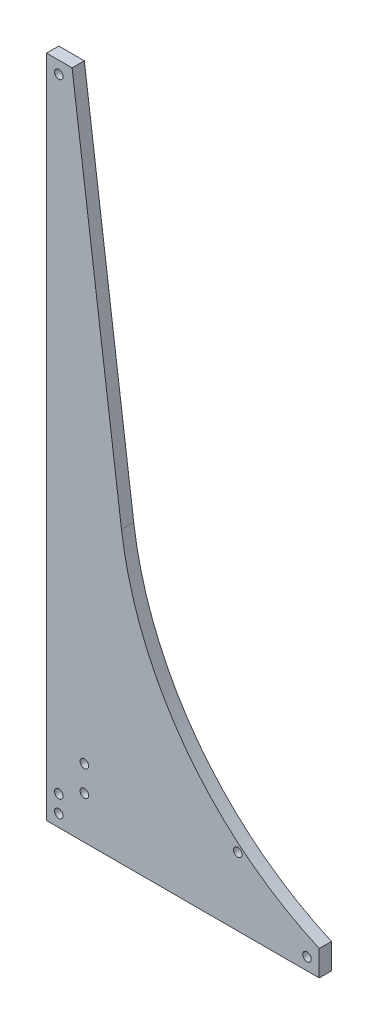
ISO-10303-21;
HEADER;
FILE_DESCRIPTION(('STEP AP214'),'2;1');
FILE_NAME('part.step','',(''),(''),'','','');
FILE_SCHEMA(('AUTOMOTIVE_DESIGN { 1 0 10303 214 1 1 1 1 }'));
ENDSEC;
DATA;
#1=APPLICATION_CONTEXT('core data for automotive mechanical design processes');
#2=APPLICATION_PROTOCOL_DEFINITION('international standard','automotive_design',2000,#1);
#3=PRODUCT_CONTEXT('',#1,'mechanical');
#4=PRODUCT('Part','Part','',(#3));
#5=PRODUCT_RELATED_PRODUCT_CATEGORY('part','',(#4));
#6=PRODUCT_DEFINITION_FORMATION('','',#4);
#7=PRODUCT_DEFINITION_CONTEXT('part definition',#1,'design');
#8=PRODUCT_DEFINITION('design','',#6,#7);
#9=PRODUCT_DEFINITION_SHAPE('','',#8);
#10=(LENGTH_UNIT() NAMED_UNIT(*) SI_UNIT(.MILLI.,.METRE.));
#11=(NAMED_UNIT(*) PLANE_ANGLE_UNIT() SI_UNIT($,.RADIAN.));
#12=(NAMED_UNIT(*) SI_UNIT($,.STERADIAN.) SOLID_ANGLE_UNIT());
#13=UNCERTAINTY_MEASURE_WITH_UNIT(LENGTH_MEASURE(1.E-05),#10,'distance_accuracy_value','');
#14=(GEOMETRIC_REPRESENTATION_CONTEXT(3) GLOBAL_UNCERTAINTY_ASSIGNED_CONTEXT((#13)) GLOBAL_UNIT_ASSIGNED_CONTEXT((#10,
#11,#12)) REPRESENTATION_CONTEXT('',''));
#15=CARTESIAN_POINT('',(0.,0.,0.));
#16=DIRECTION('',(0.,0.,1.));
#17=DIRECTION('',(1.,0.,0.));
#18=AXIS2_PLACEMENT_3D('',#15,#16,#17);
#19=CARTESIAN_POINT('',(609.538956344785,497.34603180991,18.25625));
#20=DIRECTION('',(0.,0.,1.));
#21=DIRECTION('',(1.,0.,0.));
#22=AXIS2_PLACEMENT_3D('',#19,#20,#21);
#23=PLANE('',#22);
#24=CARTESIAN_POINT('',(18.25625,43.65625,18.25625));
#25=DIRECTION('',(0.,0.,1.));
#26=DIRECTION('',(1.,0.,0.));
#27=AXIS2_PLACEMENT_3D('',#24,#25,#26);
#28=CIRCLE('',#27,6.35);
#29=CARTESIAN_POINT('',(24.60625,43.65625,18.25625));
#30=VERTEX_POINT('',#29);
#31=EDGE_CURVE('E224',#30,#30,#28,.T.);
#32=ORIENTED_EDGE('',*,*,#31,.F.);
#33=EDGE_LOOP('',(#32));
#34=FACE_BOUND('',#33,.T.);
#35=CARTESIAN_POINT('',(56.35625,101.6,18.25625));
#36=DIRECTION('',(0.,0.,1.));
#37=DIRECTION('',(1.,0.,0.));
#38=AXIS2_PLACEMENT_3D('',#35,#36,#37);
#39=CIRCLE('',#38,6.35);
#40=CARTESIAN_POINT('',(62.70625,101.6,18.25625));
#41=VERTEX_POINT('',#40);
#42=EDGE_CURVE('E240',#41,#41,#39,.T.);
#43=ORIENTED_EDGE('',*,*,#42,.F.);
#44=EDGE_LOOP('',(#43));
#45=FACE_BOUND('',#44,.T.);
#46=CARTESIAN_POINT('',(388.14375,18.25625,18.25625));
#47=DIRECTION('',(0.,0.,1.));
#48=DIRECTION('',(1.,0.,0.));
#49=AXIS2_PLACEMENT_3D('',#46,#47,#48);
#50=CIRCLE('',#49,6.34999999999994);
#51=CARTESIAN_POINT('',(394.49375,18.25625,18.25625));
#52=VERTEX_POINT('',#51);
#53=EDGE_CURVE('E256',#52,#52,#50,.T.);
#54=ORIENTED_EDGE('',*,*,#53,.F.);
#55=EDGE_LOOP('',(#54));
#56=FACE_BOUND('',#55,.T.);
#57=DIRECTION('',(0.,-1.,0.));
#58=VECTOR('',#57,1.);
#59=CARTESIAN_POINT('',(0.,0.,18.25625));
#60=LINE('',#59,#58);
#61=CARTESIAN_POINT('',(0.,990.6,18.25625));
#62=VERTEX_POINT('',#61);
#63=CARTESIAN_POINT('',(0.,0.,18.25625));
#64=VERTEX_POINT('',#63);
#65=EDGE_CURVE('E146',#62,#64,#60,.T.);
#66=ORIENTED_EDGE('',*,*,#65,.T.);
#67=DIRECTION('',(1.,0.,0.));
#68=VECTOR('',#67,1.);
#69=CARTESIAN_POINT('',(0.,0.,18.25625));
#70=LINE('',#69,#68);
#71=CARTESIAN_POINT('',(406.4,0.,18.25625));
#72=VERTEX_POINT('',#71);
#73=EDGE_CURVE('E94',#64,#72,#70,.T.);
#74=ORIENTED_EDGE('',*,*,#73,.T.);
#75=DIRECTION('',(0.,1.,0.));
#76=VECTOR('',#75,1.);
#77=CARTESIAN_POINT('',(406.4,38.1,18.25625));
#78=LINE('',#77,#76);
#79=CARTESIAN_POINT('',(406.4,38.1,18.25625));
#80=VERTEX_POINT('',#79);
#81=EDGE_CURVE('E107',#72,#80,#78,.T.);
#82=ORIENTED_EDGE('',*,*,#81,.T.);
#83=CARTESIAN_POINT('',(609.538956344785,497.34603180991,18.25625));
#84=DIRECTION('',(0.,0.,-1.));
#85=DIRECTION('',(1.,0.,0.));
#86=AXIS2_PLACEMENT_3D('',#83,#84,#85);
#87=CIRCLE('',#86,502.167654591569);
#88=CARTESIAN_POINT('',(111.667415651835,431.8,18.25625));
#89=VERTEX_POINT('',#88);
#90=EDGE_CURVE('E101',#80,#89,#87,.T.);
#91=ORIENTED_EDGE('',*,*,#90,.T.);
#92=DIRECTION('',(-0.130526192220048,0.991444861373811,0.));
#93=VECTOR('',#92,1.);
#94=CARTESIAN_POINT('',(38.1,990.6,18.25625));
#95=LINE('',#94,#93);
#96=CARTESIAN_POINT('',(38.1,990.6,18.25625));
#97=VERTEX_POINT('',#96);
#98=EDGE_CURVE('E105',#89,#97,#95,.T.);
#99=ORIENTED_EDGE('',*,*,#98,.T.);
#100=DIRECTION('',(-1.,0.,0.));
#101=VECTOR('',#100,1.);
#102=CARTESIAN_POINT('',(0.,990.6,18.25625));
#103=LINE('',#102,#101);
#104=EDGE_CURVE('E57',#97,#62,#103,.T.);
#105=ORIENTED_EDGE('',*,*,#104,.T.);
#106=EDGE_LOOP('',(#66,#74,#82,#91,#99,#105));
#107=FACE_BOUND('',#106,.T.);
#108=CARTESIAN_POINT('',(18.25625,18.25625,18.25625));
#109=DIRECTION('',(0.,0.,1.));
#110=DIRECTION('',(1.,0.,0.));
#111=AXIS2_PLACEMENT_3D('',#108,#109,#110);
#112=CIRCLE('',#111,6.35);
#113=CARTESIAN_POINT('',(24.60625,18.25625,18.25625));
#114=VERTEX_POINT('',#113);
#115=EDGE_CURVE('E134',#114,#114,#112,.T.);
#116=ORIENTED_EDGE('',*,*,#115,.F.);
#117=EDGE_LOOP('',(#116));
#118=FACE_BOUND('',#117,.T.);
#119=CARTESIAN_POINT('',(18.25625,972.34375,18.25625));
#120=DIRECTION('',(0.,0.,1.));
#121=DIRECTION('',(1.,0.,0.));
#122=AXIS2_PLACEMENT_3D('',#119,#120,#121);
#123=CIRCLE('',#122,6.35);
#124=CARTESIAN_POINT('',(24.60625,972.34375,18.25625));
#125=VERTEX_POINT('',#124);
#126=EDGE_CURVE('E248',#125,#125,#123,.T.);
#127=ORIENTED_EDGE('',*,*,#126,.F.);
#128=EDGE_LOOP('',(#127));
#129=FACE_BOUND('',#128,.T.);
#130=CARTESIAN_POINT('',(284.95625,101.6,18.25625));
#131=DIRECTION('',(0.,0.,1.));
#132=DIRECTION('',(1.,0.,0.));
#133=AXIS2_PLACEMENT_3D('',#130,#131,#132);
#134=CIRCLE('',#133,6.35);
#135=CARTESIAN_POINT('',(291.30625,101.6,18.25625));
#136=VERTEX_POINT('',#135);
#137=EDGE_CURVE('E232',#136,#136,#134,.T.);
#138=ORIENTED_EDGE('',*,*,#137,.F.);
#139=EDGE_LOOP('',(#138));
#140=FACE_BOUND('',#139,.T.);
#141=CARTESIAN_POINT('',(56.35625,63.5,18.25625));
#142=DIRECTION('',(0.,0.,1.));
#143=DIRECTION('',(1.,0.,0.));
#144=AXIS2_PLACEMENT_3D('',#141,#142,#143);
#145=CIRCLE('',#144,6.35);
#146=CARTESIAN_POINT('',(62.70625,63.5,18.25625));
#147=VERTEX_POINT('',#146);
#148=EDGE_CURVE('E213',#147,#147,#145,.T.);
#149=ORIENTED_EDGE('',*,*,#148,.F.);
#150=EDGE_LOOP('',(#149));
#151=FACE_BOUND('',#150,.T.);
#152=ADVANCED_FACE('F39',(#34,#45,#56,#107,#118,#129,#140,#151),#23,.T.);
#153=CARTESIAN_POINT('',(609.538956344785,497.34603180991,0.));
#154=DIRECTION('',(0.,0.,1.));
#155=DIRECTION('',(1.,0.,0.));
#156=AXIS2_PLACEMENT_3D('',#153,#154,#155);
#157=PLANE('',#156);
#158=DIRECTION('',(0.,-1.,0.));
#159=VECTOR('',#158,1.);
#160=CARTESIAN_POINT('',(0.,0.,0.));
#161=LINE('',#160,#159);
#162=CARTESIAN_POINT('',(0.,990.6,0.));
#163=VERTEX_POINT('',#162);
#164=CARTESIAN_POINT('',(0.,0.,0.));
#165=VERTEX_POINT('',#164);
#166=EDGE_CURVE('E129',#163,#165,#161,.T.);
#167=ORIENTED_EDGE('',*,*,#166,.F.);
#168=DIRECTION('',(-1.,0.,0.));
#169=VECTOR('',#168,1.);
#170=CARTESIAN_POINT('',(0.,990.6,0.));
#171=LINE('',#170,#169);
#172=CARTESIAN_POINT('',(38.1,990.6,0.));
#173=VERTEX_POINT('',#172);
#174=EDGE_CURVE('E86',#173,#163,#171,.T.);
#175=ORIENTED_EDGE('',*,*,#174,.F.);
#176=DIRECTION('',(-0.130526192220048,0.991444861373811,0.));
#177=VECTOR('',#176,1.);
#178=CARTESIAN_POINT('',(38.1,990.6,0.));
#179=LINE('',#178,#177);
#180=CARTESIAN_POINT('',(111.667415651835,431.8,0.));
#181=VERTEX_POINT('',#180);
#182=EDGE_CURVE('E80',#181,#173,#179,.T.);
#183=ORIENTED_EDGE('',*,*,#182,.F.);
#184=CARTESIAN_POINT('',(609.538956344785,497.34603180991,0.));
#185=DIRECTION('',(0.,0.,-1.));
#186=DIRECTION('',(1.,0.,0.));
#187=AXIS2_PLACEMENT_3D('',#184,#185,#186);
#188=CIRCLE('',#187,502.167654591569);
#189=CARTESIAN_POINT('',(406.4,38.1,0.));
#190=VERTEX_POINT('',#189);
#191=EDGE_CURVE('E116',#190,#181,#188,.T.);
#192=ORIENTED_EDGE('',*,*,#191,.F.);
#193=DIRECTION('',(0.,1.,0.));
#194=VECTOR('',#193,1.);
#195=CARTESIAN_POINT('',(406.4,38.1,0.));
#196=LINE('',#195,#194);
#197=CARTESIAN_POINT('',(406.4,0.,0.));
#198=VERTEX_POINT('',#197);
#199=EDGE_CURVE('E137',#198,#190,#196,.T.);
#200=ORIENTED_EDGE('',*,*,#199,.F.);
#201=DIRECTION('',(1.,0.,0.));
#202=VECTOR('',#201,1.);
#203=CARTESIAN_POINT('',(0.,0.,0.));
#204=LINE('',#203,#202);
#205=EDGE_CURVE('E133',#165,#198,#204,.T.);
#206=ORIENTED_EDGE('',*,*,#205,.F.);
#207=EDGE_LOOP('',(#167,#175,#183,#192,#200,#206));
#208=FACE_BOUND('',#207,.T.);
#209=CARTESIAN_POINT('',(18.25625,18.25625,0.));
#210=DIRECTION('',(0.,0.,1.));
#211=DIRECTION('',(1.,0.,0.));
#212=AXIS2_PLACEMENT_3D('',#209,#210,#211);
#213=CIRCLE('',#212,6.35);
#214=CARTESIAN_POINT('',(24.60625,18.25625,0.));
#215=VERTEX_POINT('',#214);
#216=EDGE_CURVE('E260',#215,#215,#213,.T.);
#217=ORIENTED_EDGE('',*,*,#216,.T.);
#218=EDGE_LOOP('',(#217));
#219=FACE_BOUND('',#218,.T.);
#220=CARTESIAN_POINT('',(388.14375,18.25625,0.));
#221=DIRECTION('',(0.,0.,1.));
#222=DIRECTION('',(1.,0.,0.));
#223=AXIS2_PLACEMENT_3D('',#220,#221,#222);
#224=CIRCLE('',#223,6.34999999999994);
#225=CARTESIAN_POINT('',(394.49375,18.25625,0.));
#226=VERTEX_POINT('',#225);
#227=EDGE_CURVE('E252',#226,#226,#224,.T.);
#228=ORIENTED_EDGE('',*,*,#227,.T.);
#229=EDGE_LOOP('',(#228));
#230=FACE_BOUND('',#229,.T.);
#231=CARTESIAN_POINT('',(18.25625,972.34375,0.));
#232=DIRECTION('',(0.,0.,1.));
#233=DIRECTION('',(1.,0.,0.));
#234=AXIS2_PLACEMENT_3D('',#231,#232,#233);
#235=CIRCLE('',#234,6.35);
#236=CARTESIAN_POINT('',(24.60625,972.34375,0.));
#237=VERTEX_POINT('',#236);
#238=EDGE_CURVE('E244',#237,#237,#235,.T.);
#239=ORIENTED_EDGE('',*,*,#238,.T.);
#240=EDGE_LOOP('',(#239));
#241=FACE_BOUND('',#240,.T.);
#242=CARTESIAN_POINT('',(56.35625,101.6,0.));
#243=DIRECTION('',(0.,0.,1.));
#244=DIRECTION('',(1.,0.,0.));
#245=AXIS2_PLACEMENT_3D('',#242,#243,#244);
#246=CIRCLE('',#245,6.35);
#247=CARTESIAN_POINT('',(62.70625,101.6,0.));
#248=VERTEX_POINT('',#247);
#249=EDGE_CURVE('E236',#248,#248,#246,.T.);
#250=ORIENTED_EDGE('',*,*,#249,.T.);
#251=EDGE_LOOP('',(#250));
#252=FACE_BOUND('',#251,.T.);
#253=CARTESIAN_POINT('',(284.95625,101.6,0.));
#254=DIRECTION('',(0.,0.,1.));
#255=DIRECTION('',(1.,0.,0.));
#256=AXIS2_PLACEMENT_3D('',#253,#254,#255);
#257=CIRCLE('',#256,6.35);
#258=CARTESIAN_POINT('',(291.30625,101.6,0.));
#259=VERTEX_POINT('',#258);
#260=EDGE_CURVE('E228',#259,#259,#257,.T.);
#261=ORIENTED_EDGE('',*,*,#260,.T.);
#262=EDGE_LOOP('',(#261));
#263=FACE_BOUND('',#262,.T.);
#264=CARTESIAN_POINT('',(18.25625,43.65625,0.));
#265=DIRECTION('',(0.,0.,1.));
#266=DIRECTION('',(1.,0.,0.));
#267=AXIS2_PLACEMENT_3D('',#264,#265,#266);
#268=CIRCLE('',#267,6.35);
#269=CARTESIAN_POINT('',(24.60625,43.65625,0.));
#270=VERTEX_POINT('',#269);
#271=EDGE_CURVE('E221',#270,#270,#268,.T.);
#272=ORIENTED_EDGE('',*,*,#271,.T.);
#273=EDGE_LOOP('',(#272));
#274=FACE_BOUND('',#273,.T.);
#275=CARTESIAN_POINT('',(56.35625,63.5,0.));
#276=DIRECTION('',(0.,0.,1.));
#277=DIRECTION('',(1.,0.,0.));
#278=AXIS2_PLACEMENT_3D('',#275,#276,#277);
#279=CIRCLE('',#278,6.35);
#280=CARTESIAN_POINT('',(62.70625,63.5,0.));
#281=VERTEX_POINT('',#280);
#282=EDGE_CURVE('E216',#281,#281,#279,.T.);
#283=ORIENTED_EDGE('',*,*,#282,.T.);
#284=EDGE_LOOP('',(#283));
#285=FACE_BOUND('',#284,.T.);
#286=ADVANCED_FACE('F159',(#208,#219,#230,#241,#252,#263,#274,#285),#157,.F.);
#287=CARTESIAN_POINT('',(0.,0.,18.25625));
#288=DIRECTION('',(1.,0.,0.));
#289=DIRECTION('',(0.,0.,-1.));
#290=AXIS2_PLACEMENT_3D('',#287,#288,#289);
#291=PLANE('',#290);
#292=ORIENTED_EDGE('',*,*,#166,.T.);
#293=DIRECTION('',(0.,0.,-1.));
#294=VECTOR('',#293,1.);
#295=CARTESIAN_POINT('',(0.,0.,18.25625));
#296=LINE('',#295,#294);
#297=EDGE_CURVE('E11',#64,#165,#296,.T.);
#298=ORIENTED_EDGE('',*,*,#297,.F.);
#299=ORIENTED_EDGE('',*,*,#65,.F.);
#300=DIRECTION('',(0.,0.,-1.));
#301=VECTOR('',#300,1.);
#302=CARTESIAN_POINT('',(0.,990.6,18.25625));
#303=LINE('',#302,#301);
#304=EDGE_CURVE('E125',#62,#163,#303,.T.);
#305=ORIENTED_EDGE('',*,*,#304,.T.);
#306=EDGE_LOOP('',(#292,#298,#299,#305));
#307=FACE_BOUND('',#306,.T.);
#308=ADVANCED_FACE('F41',(#307),#291,.F.);
#309=CARTESIAN_POINT('',(0.,0.,18.25625));
#310=DIRECTION('',(0.,1.,0.));
#311=DIRECTION('',(0.,0.,1.));
#312=AXIS2_PLACEMENT_3D('',#309,#310,#311);
#313=PLANE('',#312);
#314=ORIENTED_EDGE('',*,*,#205,.T.);
#315=DIRECTION('',(0.,0.,-1.));
#316=VECTOR('',#315,1.);
#317=CARTESIAN_POINT('',(406.4,0.,18.25625));
#318=LINE('',#317,#316);
#319=EDGE_CURVE('E49',#72,#198,#318,.T.);
#320=ORIENTED_EDGE('',*,*,#319,.F.);
#321=ORIENTED_EDGE('',*,*,#73,.F.);
#322=ORIENTED_EDGE('',*,*,#297,.T.);
#323=EDGE_LOOP('',(#314,#320,#321,#322));
#324=FACE_BOUND('',#323,.T.);
#325=ADVANCED_FACE('F351',(#324),#313,.F.);
#326=CARTESIAN_POINT('',(406.4,38.1,18.25625));
#327=DIRECTION('',(-1.,0.,0.));
#328=DIRECTION('',(0.,0.,1.));
#329=AXIS2_PLACEMENT_3D('',#326,#327,#328);
#330=PLANE('',#329);
#331=ORIENTED_EDGE('',*,*,#199,.T.);
#332=DIRECTION('',(0.,0.,-1.));
#333=VECTOR('',#332,1.);
#334=CARTESIAN_POINT('',(406.4,38.1,18.25625));
#335=LINE('',#334,#333);
#336=EDGE_CURVE('E118',#80,#190,#335,.T.);
#337=ORIENTED_EDGE('',*,*,#336,.F.);
#338=ORIENTED_EDGE('',*,*,#81,.F.);
#339=ORIENTED_EDGE('',*,*,#319,.T.);
#340=EDGE_LOOP('',(#331,#337,#338,#339));
#341=FACE_BOUND('',#340,.T.);
#342=ADVANCED_FACE('F156',(#341),#330,.F.);
#343=CARTESIAN_POINT('',(609.538956344785,497.34603180991,18.25625));
#344=DIRECTION('',(0.,0.,-1.));
#345=DIRECTION('',(-1.,0.,0.));
#346=AXIS2_PLACEMENT_3D('',#343,#344,#345);
#347=CYLINDRICAL_SURFACE('',#346,502.167654591569);
#348=ORIENTED_EDGE('',*,*,#191,.T.);
#349=DIRECTION('',(0.,0.,-1.));
#350=VECTOR('',#349,1.);
#351=CARTESIAN_POINT('',(111.667415651835,431.8,18.25625));
#352=LINE('',#351,#350);
#353=EDGE_CURVE('E113',#89,#181,#352,.T.);
#354=ORIENTED_EDGE('',*,*,#353,.F.);
#355=ORIENTED_EDGE('',*,*,#90,.F.);
#356=ORIENTED_EDGE('',*,*,#336,.T.);
#357=EDGE_LOOP('',(#348,#354,#355,#356));
#358=FACE_BOUND('',#357,.T.);
#359=ADVANCED_FACE('F114',(#358),#347,.F.);
#360=CARTESIAN_POINT('',(38.1,990.6,18.25625));
#361=DIRECTION('',(-0.991444861373811,-0.130526192220048,0.));
#362=DIRECTION('',(0.130526192220048,-0.991444861373811,0.));
#363=AXIS2_PLACEMENT_3D('',#360,#361,#362);
#364=PLANE('',#363);
#365=ORIENTED_EDGE('',*,*,#182,.T.);
#366=DIRECTION('',(0.,0.,-1.));
#367=VECTOR('',#366,1.);
#368=CARTESIAN_POINT('',(38.1,990.6,18.25625));
#369=LINE('',#368,#367);
#370=EDGE_CURVE('E119',#97,#173,#369,.T.);
#371=ORIENTED_EDGE('',*,*,#370,.F.);
#372=ORIENTED_EDGE('',*,*,#98,.F.);
#373=ORIENTED_EDGE('',*,*,#353,.T.);
#374=EDGE_LOOP('',(#365,#371,#372,#373));
#375=FACE_BOUND('',#374,.T.);
#376=ADVANCED_FACE('F121',(#375),#364,.F.);
#377=CARTESIAN_POINT('',(0.,990.6,18.25625));
#378=DIRECTION('',(0.,-1.,0.));
#379=DIRECTION('',(0.,0.,-1.));
#380=AXIS2_PLACEMENT_3D('',#377,#378,#379);
#381=PLANE('',#380);
#382=ORIENTED_EDGE('',*,*,#174,.T.);
#383=ORIENTED_EDGE('',*,*,#304,.F.);
#384=ORIENTED_EDGE('',*,*,#104,.F.);
#385=ORIENTED_EDGE('',*,*,#370,.T.);
#386=EDGE_LOOP('',(#382,#383,#384,#385));
#387=FACE_BOUND('',#386,.T.);
#388=ADVANCED_FACE('F164',(#387),#381,.F.);
#389=CARTESIAN_POINT('',(18.25625,18.25625,18.25625));
#390=DIRECTION('',(0.,0.,-1.));
#391=DIRECTION('',(-1.,0.,0.));
#392=AXIS2_PLACEMENT_3D('',#389,#390,#391);
#393=CYLINDRICAL_SURFACE('',#392,6.35);
#394=ORIENTED_EDGE('',*,*,#115,.T.);
#395=EDGE_LOOP('',(#394));
#396=FACE_BOUND('',#395,.T.);
#397=ORIENTED_EDGE('',*,*,#216,.F.);
#398=EDGE_LOOP('',(#397));
#399=FACE_BOUND('',#398,.T.);
#400=ADVANCED_FACE('F166',(#396,#399),#393,.F.);
#401=CARTESIAN_POINT('',(388.14375,18.25625,18.25625));
#402=DIRECTION('',(0.,0.,-1.));
#403=DIRECTION('',(-1.,0.,0.));
#404=AXIS2_PLACEMENT_3D('',#401,#402,#403);
#405=CYLINDRICAL_SURFACE('',#404,6.34999999999994);
#406=ORIENTED_EDGE('',*,*,#53,.T.);
#407=EDGE_LOOP('',(#406));
#408=FACE_BOUND('',#407,.T.);
#409=ORIENTED_EDGE('',*,*,#227,.F.);
#410=EDGE_LOOP('',(#409));
#411=FACE_BOUND('',#410,.T.);
#412=ADVANCED_FACE('F172',(#408,#411),#405,.F.);
#413=CARTESIAN_POINT('',(18.25625,972.34375,18.25625));
#414=DIRECTION('',(0.,0.,-1.));
#415=DIRECTION('',(-1.,0.,0.));
#416=AXIS2_PLACEMENT_3D('',#413,#414,#415);
#417=CYLINDRICAL_SURFACE('',#416,6.35);
#418=ORIENTED_EDGE('',*,*,#126,.T.);
#419=EDGE_LOOP('',(#418));
#420=FACE_BOUND('',#419,.T.);
#421=ORIENTED_EDGE('',*,*,#238,.F.);
#422=EDGE_LOOP('',(#421));
#423=FACE_BOUND('',#422,.T.);
#424=ADVANCED_FACE('F188',(#420,#423),#417,.F.);
#425=CARTESIAN_POINT('',(56.35625,101.6,18.25625));
#426=DIRECTION('',(0.,0.,-1.));
#427=DIRECTION('',(-1.,0.,0.));
#428=AXIS2_PLACEMENT_3D('',#425,#426,#427);
#429=CYLINDRICAL_SURFACE('',#428,6.35);
#430=ORIENTED_EDGE('',*,*,#42,.T.);
#431=EDGE_LOOP('',(#430));
#432=FACE_BOUND('',#431,.T.);
#433=ORIENTED_EDGE('',*,*,#249,.F.);
#434=EDGE_LOOP('',(#433));
#435=FACE_BOUND('',#434,.T.);
#436=ADVANCED_FACE('F192',(#432,#435),#429,.F.);
#437=CARTESIAN_POINT('',(284.95625,101.6,18.25625));
#438=DIRECTION('',(0.,0.,-1.));
#439=DIRECTION('',(-1.,0.,0.));
#440=AXIS2_PLACEMENT_3D('',#437,#438,#439);
#441=CYLINDRICAL_SURFACE('',#440,6.35);
#442=ORIENTED_EDGE('',*,*,#137,.T.);
#443=EDGE_LOOP('',(#442));
#444=FACE_BOUND('',#443,.T.);
#445=ORIENTED_EDGE('',*,*,#260,.F.);
#446=EDGE_LOOP('',(#445));
#447=FACE_BOUND('',#446,.T.);
#448=ADVANCED_FACE('F196',(#444,#447),#441,.F.);
#449=CARTESIAN_POINT('',(18.25625,43.65625,18.25625));
#450=DIRECTION('',(0.,0.,-1.));
#451=DIRECTION('',(-1.,0.,0.));
#452=AXIS2_PLACEMENT_3D('',#449,#450,#451);
#453=CYLINDRICAL_SURFACE('',#452,6.35);
#454=ORIENTED_EDGE('',*,*,#31,.T.);
#455=EDGE_LOOP('',(#454));
#456=FACE_BOUND('',#455,.T.);
#457=ORIENTED_EDGE('',*,*,#271,.F.);
#458=EDGE_LOOP('',(#457));
#459=FACE_BOUND('',#458,.T.);
#460=ADVANCED_FACE('F200',(#456,#459),#453,.F.);
#461=CARTESIAN_POINT('',(56.35625,63.5,18.25625));
#462=DIRECTION('',(0.,0.,-1.));
#463=DIRECTION('',(-1.,0.,0.));
#464=AXIS2_PLACEMENT_3D('',#461,#462,#463);
#465=CYLINDRICAL_SURFACE('',#464,6.35);
#466=ORIENTED_EDGE('',*,*,#148,.T.);
#467=EDGE_LOOP('',(#466));
#468=FACE_BOUND('',#467,.T.);
#469=ORIENTED_EDGE('',*,*,#282,.F.);
#470=EDGE_LOOP('',(#469));
#471=FACE_BOUND('',#470,.T.);
#472=ADVANCED_FACE('F204',(#468,#471),#465,.F.);
#473=CLOSED_SHELL('',(#152,#286,#308,#325,#342,#359,#376,#388,#400,#412,#424,#436,#448,#460,#472));
#474=MANIFOLD_SOLID_BREP('B2',#473);
#475=ADVANCED_BREP_SHAPE_REPRESENTATION('',(#18,#474),#14);
#476=SHAPE_DEFINITION_REPRESENTATION(#9,#475);
ENDSEC;
END-ISO-10303-21;
